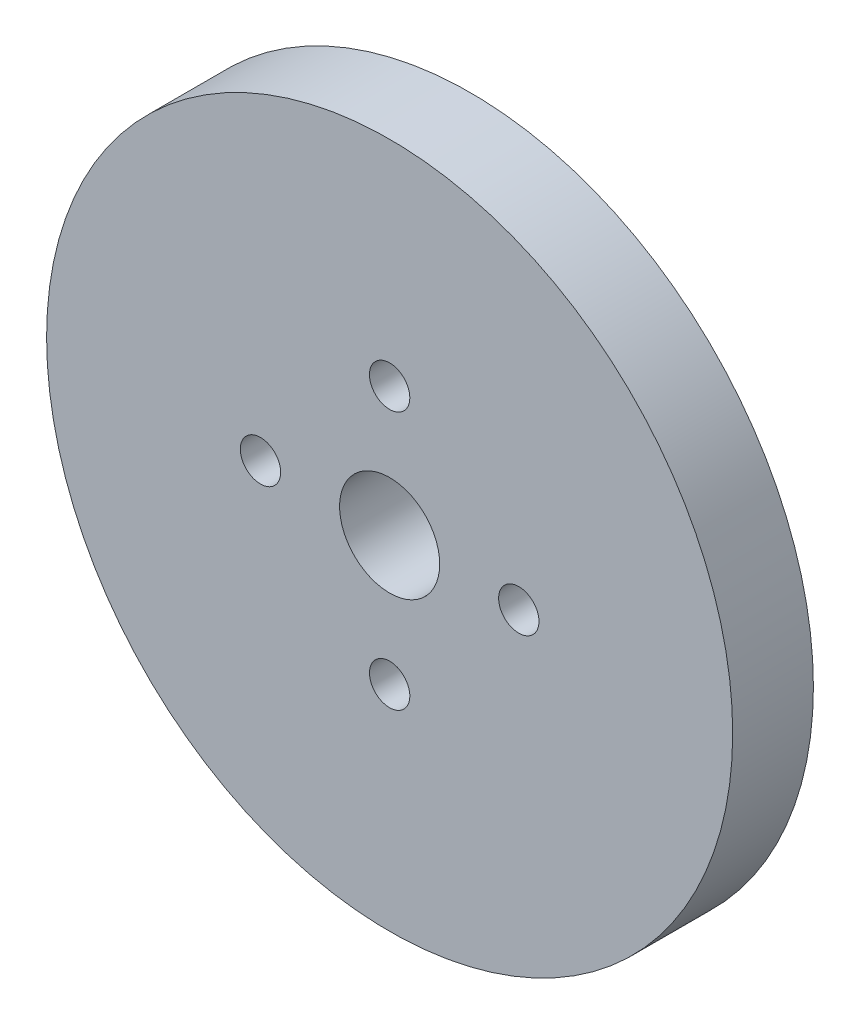
ISO-10303-21;
HEADER;
FILE_DESCRIPTION(('STEP AP214'),'2;1');
FILE_NAME('part.step','',(''),(''),'','','');
FILE_SCHEMA(('AUTOMOTIVE_DESIGN { 1 0 10303 214 1 1 1 1 }'));
ENDSEC;
DATA;
#1=APPLICATION_CONTEXT('core data for automotive mechanical design processes');
#2=APPLICATION_PROTOCOL_DEFINITION('international standard','automotive_design',2000,#1);
#3=PRODUCT_CONTEXT('',#1,'mechanical');
#4=PRODUCT('Part','Part','',(#3));
#5=PRODUCT_RELATED_PRODUCT_CATEGORY('part','',(#4));
#6=PRODUCT_DEFINITION_FORMATION('','',#4);
#7=PRODUCT_DEFINITION_CONTEXT('part definition',#1,'design');
#8=PRODUCT_DEFINITION('design','',#6,#7);
#9=PRODUCT_DEFINITION_SHAPE('','',#8);
#10=(LENGTH_UNIT() NAMED_UNIT(*) SI_UNIT(.MILLI.,.METRE.));
#11=(NAMED_UNIT(*) PLANE_ANGLE_UNIT() SI_UNIT($,.RADIAN.));
#12=(NAMED_UNIT(*) SI_UNIT($,.STERADIAN.) SOLID_ANGLE_UNIT());
#13=UNCERTAINTY_MEASURE_WITH_UNIT(LENGTH_MEASURE(1.E-05),#10,'distance_accuracy_value','');
#14=(GEOMETRIC_REPRESENTATION_CONTEXT(3) GLOBAL_UNCERTAINTY_ASSIGNED_CONTEXT((#13)) GLOBAL_UNIT_ASSIGNED_CONTEXT((#10,
#11,#12)) REPRESENTATION_CONTEXT('',''));
#15=CARTESIAN_POINT('',(0.,0.,0.));
#16=DIRECTION('',(0.,0.,1.));
#17=DIRECTION('',(1.,0.,0.));
#18=AXIS2_PLACEMENT_3D('',#15,#16,#17);
#19=CARTESIAN_POINT('',(0.,0.,5.));
#20=DIRECTION('',(0.,0.,1.));
#21=DIRECTION('',(1.,0.,0.));
#22=AXIS2_PLACEMENT_3D('',#19,#20,#21);
#23=PLANE('',#22);
#24=CARTESIAN_POINT('',(0.,0.,5.));
#25=DIRECTION('',(0.,0.,1.));
#26=DIRECTION('',(-1.,0.,0.));
#27=AXIS2_PLACEMENT_3D('',#24,#25,#26);
#28=CIRCLE('',#27,21.25);
#29=CARTESIAN_POINT('',(21.25,0.,5.));
#30=VERTEX_POINT('',#29);
#31=EDGE_CURVE('E27',#30,#30,#28,.T.);
#32=ORIENTED_EDGE('',*,*,#31,.T.);
#33=EDGE_LOOP('',(#32));
#34=FACE_BOUND('',#33,.T.);
#35=CARTESIAN_POINT('',(-8.00011448707171,0.000188697153868013,5.));
#36=DIRECTION('',(0.,0.,-1.));
#37=DIRECTION('',(-1.,0.,0.));
#38=AXIS2_PLACEMENT_3D('',#35,#36,#37);
#39=CIRCLE('',#38,1.25);
#40=CARTESIAN_POINT('',(-6.75011448707171,0.000188697153868167,5.));
#41=VERTEX_POINT('',#40);
#42=EDGE_CURVE('E75',#41,#41,#39,.T.);
#43=ORIENTED_EDGE('',*,*,#42,.T.);
#44=EDGE_LOOP('',(#43));
#45=FACE_BOUND('',#44,.T.);
#46=CARTESIAN_POINT('',(7.99988551292831,0.000188697153865394,5.));
#47=DIRECTION('',(0.,0.,-1.));
#48=DIRECTION('',(-1.,0.,0.));
#49=AXIS2_PLACEMENT_3D('',#46,#47,#48);
#50=CIRCLE('',#49,1.25);
#51=CARTESIAN_POINT('',(9.24988551292831,0.000188697153865548,5.));
#52=VERTEX_POINT('',#51);
#53=EDGE_CURVE('E20',#52,#52,#50,.T.);
#54=ORIENTED_EDGE('',*,*,#53,.T.);
#55=EDGE_LOOP('',(#54));
#56=FACE_BOUND('',#55,.T.);
#57=CARTESIAN_POINT('',(-0.000114487071697185,8.00018869715386,5.));
#58=DIRECTION('',(0.,0.,-1.));
#59=DIRECTION('',(-1.,0.,0.));
#60=AXIS2_PLACEMENT_3D('',#57,#58,#59);
#61=CIRCLE('',#60,1.25);
#62=CARTESIAN_POINT('',(1.2498855129283,8.00018869715386,5.));
#63=VERTEX_POINT('',#62);
#64=EDGE_CURVE('E64',#63,#63,#61,.T.);
#65=ORIENTED_EDGE('',*,*,#64,.T.);
#66=EDGE_LOOP('',(#65));
#67=FACE_BOUND('',#66,.T.);
#68=CARTESIAN_POINT('',(-0.000114487071699813,-7.99981130284614,5.));
#69=DIRECTION('',(0.,0.,-1.));
#70=DIRECTION('',(-0.197777228533596,0.980246993299939,0.));
#71=AXIS2_PLACEMENT_3D('',#68,#69,#70);
#72=CIRCLE('',#71,1.25000000064029);
#73=CARTESIAN_POINT('',(-0.247336022866286,-9.22512004509567,5.));
#74=VERTEX_POINT('',#73);
#75=EDGE_CURVE('E65',#74,#74,#72,.T.);
#76=ORIENTED_EDGE('',*,*,#75,.T.);
#77=EDGE_LOOP('',(#76));
#78=FACE_BOUND('',#77,.T.);
#79=CARTESIAN_POINT('',(-0.000114487071698486,0.000188697153866704,5.));
#80=DIRECTION('',(0.,0.,-1.));
#81=DIRECTION('',(-1.,0.,0.));
#82=AXIS2_PLACEMENT_3D('',#79,#80,#81);
#83=CIRCLE('',#82,3.1);
#84=CARTESIAN_POINT('',(3.0998855129283,0.000188697153867084,5.));
#85=VERTEX_POINT('',#84);
#86=EDGE_CURVE('E107',#85,#85,#83,.T.);
#87=ORIENTED_EDGE('',*,*,#86,.T.);
#88=EDGE_LOOP('',(#87));
#89=FACE_BOUND('',#88,.T.);
#90=ADVANCED_FACE('F16',(#34,#45,#56,#67,#78,#89),#23,.T.);
#91=CARTESIAN_POINT('',(0.,0.,0.));
#92=DIRECTION('',(0.,0.,1.));
#93=DIRECTION('',(1.,0.,0.));
#94=AXIS2_PLACEMENT_3D('',#91,#92,#93);
#95=PLANE('',#94);
#96=CARTESIAN_POINT('',(0.,0.,0.));
#97=DIRECTION('',(0.,0.,-1.));
#98=DIRECTION('',(-1.,0.,0.));
#99=AXIS2_PLACEMENT_3D('',#96,#97,#98);
#100=CIRCLE('',#99,21.25);
#101=CARTESIAN_POINT('',(21.25,0.,0.));
#102=VERTEX_POINT('',#101);
#103=EDGE_CURVE('E11',#102,#102,#100,.T.);
#104=ORIENTED_EDGE('',*,*,#103,.T.);
#105=EDGE_LOOP('',(#104));
#106=FACE_BOUND('',#105,.T.);
#107=CARTESIAN_POINT('',(-8.00011448707171,0.000188697153868013,0.));
#108=DIRECTION('',(0.,0.,1.));
#109=DIRECTION('',(-1.,0.,0.));
#110=AXIS2_PLACEMENT_3D('',#107,#108,#109);
#111=CIRCLE('',#110,1.25);
#112=CARTESIAN_POINT('',(-6.75011448707171,0.000188697153868167,0.));
#113=VERTEX_POINT('',#112);
#114=EDGE_CURVE('E73',#113,#113,#111,.T.);
#115=ORIENTED_EDGE('',*,*,#114,.T.);
#116=EDGE_LOOP('',(#115));
#117=FACE_BOUND('',#116,.T.);
#118=CARTESIAN_POINT('',(7.99988551292831,0.000188697153865394,0.));
#119=DIRECTION('',(0.,0.,1.));
#120=DIRECTION('',(-1.,0.,0.));
#121=AXIS2_PLACEMENT_3D('',#118,#119,#120);
#122=CIRCLE('',#121,1.25);
#123=CARTESIAN_POINT('',(9.24988551292831,0.000188697153865548,0.));
#124=VERTEX_POINT('',#123);
#125=EDGE_CURVE('E77',#124,#124,#122,.T.);
#126=ORIENTED_EDGE('',*,*,#125,.T.);
#127=EDGE_LOOP('',(#126));
#128=FACE_BOUND('',#127,.T.);
#129=CARTESIAN_POINT('',(-0.000114487071697185,8.00018869715386,0.));
#130=DIRECTION('',(0.,0.,1.));
#131=DIRECTION('',(-1.,0.,0.));
#132=AXIS2_PLACEMENT_3D('',#129,#130,#131);
#133=CIRCLE('',#132,1.25);
#134=CARTESIAN_POINT('',(1.2498855129283,8.00018869715386,0.));
#135=VERTEX_POINT('',#134);
#136=EDGE_CURVE('E67',#135,#135,#133,.T.);
#137=ORIENTED_EDGE('',*,*,#136,.T.);
#138=EDGE_LOOP('',(#137));
#139=FACE_BOUND('',#138,.T.);
#140=CARTESIAN_POINT('',(-0.000114487071699813,-7.99981130284614,0.));
#141=DIRECTION('',(0.,0.,1.));
#142=DIRECTION('',(-0.197777228533596,0.980246993299939,0.));
#143=AXIS2_PLACEMENT_3D('',#140,#141,#142);
#144=CIRCLE('',#143,1.25000000064029);
#145=CARTESIAN_POINT('',(-0.247336022866286,-9.22512004509567,0.));
#146=VERTEX_POINT('',#145);
#147=EDGE_CURVE('E61',#146,#146,#144,.T.);
#148=ORIENTED_EDGE('',*,*,#147,.T.);
#149=EDGE_LOOP('',(#148));
#150=FACE_BOUND('',#149,.T.);
#151=CARTESIAN_POINT('',(-0.000114487071698486,0.000188697153866704,0.));
#152=DIRECTION('',(0.,0.,1.));
#153=DIRECTION('',(-1.,0.,0.));
#154=AXIS2_PLACEMENT_3D('',#151,#152,#153);
#155=CIRCLE('',#154,3.1);
#156=CARTESIAN_POINT('',(3.0998855129283,0.000188697153867084,0.));
#157=VERTEX_POINT('',#156);
#158=EDGE_CURVE('E69',#157,#157,#155,.T.);
#159=ORIENTED_EDGE('',*,*,#158,.T.);
#160=EDGE_LOOP('',(#159));
#161=FACE_BOUND('',#160,.T.);
#162=ADVANCED_FACE('F18',(#106,#117,#128,#139,#150,#161),#95,.F.);
#163=CARTESIAN_POINT('',(0.,0.,0.));
#164=DIRECTION('',(0.,0.,-1.));
#165=DIRECTION('',(-1.,0.,0.));
#166=AXIS2_PLACEMENT_3D('',#163,#164,#165);
#167=CYLINDRICAL_SURFACE('',#166,21.25);
#168=ORIENTED_EDGE('',*,*,#103,.F.);
#169=EDGE_LOOP('',(#168));
#170=FACE_BOUND('',#169,.T.);
#171=ORIENTED_EDGE('',*,*,#31,.F.);
#172=EDGE_LOOP('',(#171));
#173=FACE_BOUND('',#172,.T.);
#174=ADVANCED_FACE('F92',(#170,#173),#167,.T.);
#175=CARTESIAN_POINT('',(-8.00011448707171,0.000188697153868013,0.));
#176=DIRECTION('',(0.,0.,-1.));
#177=DIRECTION('',(-1.,0.,0.));
#178=AXIS2_PLACEMENT_3D('',#175,#176,#177);
#179=CYLINDRICAL_SURFACE('',#178,1.25);
#180=ORIENTED_EDGE('',*,*,#114,.F.);
#181=EDGE_LOOP('',(#180));
#182=FACE_BOUND('',#181,.T.);
#183=ORIENTED_EDGE('',*,*,#42,.F.);
#184=EDGE_LOOP('',(#183));
#185=FACE_BOUND('',#184,.T.);
#186=ADVANCED_FACE('F88',(#182,#185),#179,.F.);
#187=CARTESIAN_POINT('',(7.99988551292831,0.000188697153865394,0.));
#188=DIRECTION('',(0.,0.,-1.));
#189=DIRECTION('',(-1.,0.,0.));
#190=AXIS2_PLACEMENT_3D('',#187,#188,#189);
#191=CYLINDRICAL_SURFACE('',#190,1.25);
#192=ORIENTED_EDGE('',*,*,#125,.F.);
#193=EDGE_LOOP('',(#192));
#194=FACE_BOUND('',#193,.T.);
#195=ORIENTED_EDGE('',*,*,#53,.F.);
#196=EDGE_LOOP('',(#195));
#197=FACE_BOUND('',#196,.T.);
#198=ADVANCED_FACE('F91',(#194,#197),#191,.F.);
#199=CARTESIAN_POINT('',(-0.000114487071697185,8.00018869715386,0.));
#200=DIRECTION('',(0.,0.,-1.));
#201=DIRECTION('',(-1.,0.,0.));
#202=AXIS2_PLACEMENT_3D('',#199,#200,#201);
#203=CYLINDRICAL_SURFACE('',#202,1.25);
#204=ORIENTED_EDGE('',*,*,#136,.F.);
#205=EDGE_LOOP('',(#204));
#206=FACE_BOUND('',#205,.T.);
#207=ORIENTED_EDGE('',*,*,#64,.F.);
#208=EDGE_LOOP('',(#207));
#209=FACE_BOUND('',#208,.T.);
#210=ADVANCED_FACE('F115',(#206,#209),#203,.F.);
#211=CARTESIAN_POINT('',(-0.000114487071699813,-7.99981130284614,0.));
#212=DIRECTION('',(0.,0.,-1.));
#213=DIRECTION('',(-0.197777228533596,0.980246993299939,0.));
#214=AXIS2_PLACEMENT_3D('',#211,#212,#213);
#215=CYLINDRICAL_SURFACE('',#214,1.25000000064029);
#216=ORIENTED_EDGE('',*,*,#147,.F.);
#217=EDGE_LOOP('',(#216));
#218=FACE_BOUND('',#217,.T.);
#219=ORIENTED_EDGE('',*,*,#75,.F.);
#220=EDGE_LOOP('',(#219));
#221=FACE_BOUND('',#220,.T.);
#222=ADVANCED_FACE('F118',(#218,#221),#215,.F.);
#223=CARTESIAN_POINT('',(-0.000114487071698486,0.000188697153866704,0.));
#224=DIRECTION('',(0.,0.,-1.));
#225=DIRECTION('',(-1.,0.,0.));
#226=AXIS2_PLACEMENT_3D('',#223,#224,#225);
#227=CYLINDRICAL_SURFACE('',#226,3.1);
#228=ORIENTED_EDGE('',*,*,#158,.F.);
#229=EDGE_LOOP('',(#228));
#230=FACE_BOUND('',#229,.T.);
#231=ORIENTED_EDGE('',*,*,#86,.F.);
#232=EDGE_LOOP('',(#231));
#233=FACE_BOUND('',#232,.T.);
#234=ADVANCED_FACE('F126',(#230,#233),#227,.F.);
#235=CLOSED_SHELL('',(#90,#162,#174,#186,#198,#210,#222,#234));
#236=MANIFOLD_SOLID_BREP('B1',#235);
#237=ADVANCED_BREP_SHAPE_REPRESENTATION('',(#18,#236),#14);
#238=SHAPE_DEFINITION_REPRESENTATION(#9,#237);
ENDSEC;
END-ISO-10303-21;
